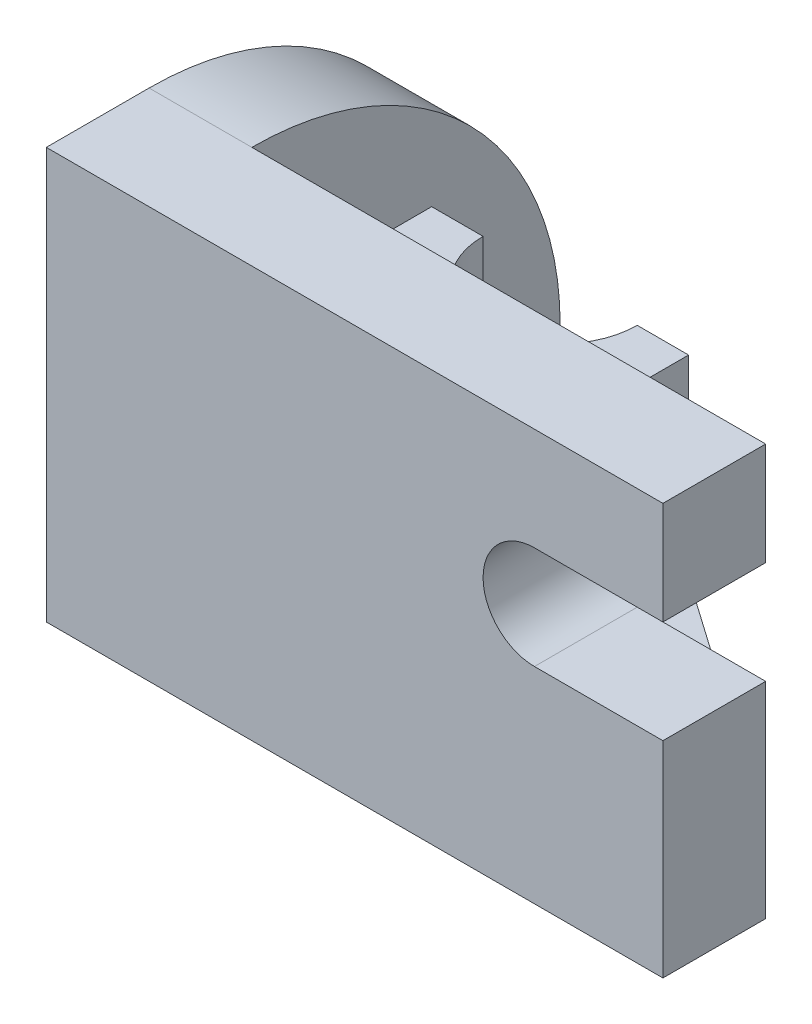
ISO-10303-21;
HEADER;
FILE_DESCRIPTION(('STEP AP214'),'2;1');
FILE_NAME('part.step','',(''),(''),'','','');
FILE_SCHEMA(('AUTOMOTIVE_DESIGN { 1 0 10303 214 1 1 1 1 }'));
ENDSEC;
DATA;
#1=APPLICATION_CONTEXT('core data for automotive mechanical design processes');
#2=APPLICATION_PROTOCOL_DEFINITION('international standard','automotive_design',2000,#1);
#3=PRODUCT_CONTEXT('',#1,'mechanical');
#4=PRODUCT('Part','Part','',(#3));
#5=PRODUCT_RELATED_PRODUCT_CATEGORY('part','',(#4));
#6=PRODUCT_DEFINITION_FORMATION('','',#4);
#7=PRODUCT_DEFINITION_CONTEXT('part definition',#1,'design');
#8=PRODUCT_DEFINITION('design','',#6,#7);
#9=PRODUCT_DEFINITION_SHAPE('','',#8);
#10=(LENGTH_UNIT() NAMED_UNIT(*) SI_UNIT(.MILLI.,.METRE.));
#11=(NAMED_UNIT(*) PLANE_ANGLE_UNIT() SI_UNIT($,.RADIAN.));
#12=(NAMED_UNIT(*) SI_UNIT($,.STERADIAN.) SOLID_ANGLE_UNIT());
#13=UNCERTAINTY_MEASURE_WITH_UNIT(LENGTH_MEASURE(1.E-05),#10,'distance_accuracy_value','');
#14=(GEOMETRIC_REPRESENTATION_CONTEXT(3) GLOBAL_UNCERTAINTY_ASSIGNED_CONTEXT((#13)) GLOBAL_UNIT_ASSIGNED_CONTEXT((#10,
#11,#12)) REPRESENTATION_CONTEXT('',''));
#15=CARTESIAN_POINT('',(0.,0.,0.));
#16=DIRECTION('',(0.,0.,1.));
#17=DIRECTION('',(1.,0.,0.));
#18=AXIS2_PLACEMENT_3D('',#15,#16,#17);
#19=CARTESIAN_POINT('',(0.,0.,-8.));
#20=DIRECTION('',(0.,0.,1.));
#21=DIRECTION('',(1.,0.,0.));
#22=AXIS2_PLACEMENT_3D('',#19,#20,#21);
#23=PLANE('',#22);
#24=DIRECTION('',(0.,-1.,0.));
#25=VECTOR('',#24,1.);
#26=CARTESIAN_POINT('',(-32.,0.,-8.));
#27=LINE('',#26,#25);
#28=CARTESIAN_POINT('',(-32.,32.,-8.));
#29=VERTEX_POINT('',#28);
#30=CARTESIAN_POINT('',(-32.,10.,-8.));
#31=VERTEX_POINT('',#30);
#32=EDGE_CURVE('E55',#29,#31,#27,.T.);
#33=ORIENTED_EDGE('',*,*,#32,.F.);
#34=DIRECTION('',(-1.,0.,0.));
#35=VECTOR('',#34,1.);
#36=CARTESIAN_POINT('',(-48.,32.,-8.));
#37=LINE('',#36,#35);
#38=CARTESIAN_POINT('',(48.,32.,-8.));
#39=VERTEX_POINT('',#38);
#40=EDGE_CURVE('E316',#39,#29,#37,.T.);
#41=ORIENTED_EDGE('',*,*,#40,.F.);
#42=DIRECTION('',(0.,1.,0.));
#43=VECTOR('',#42,1.);
#44=CARTESIAN_POINT('',(48.,32.,-8.));
#45=LINE('',#44,#43);
#46=CARTESIAN_POINT('',(48.,16.,-8.));
#47=VERTEX_POINT('',#46);
#48=EDGE_CURVE('E287',#47,#39,#45,.T.);
#49=ORIENTED_EDGE('',*,*,#48,.F.);
#50=DIRECTION('',(-1.,0.,0.));
#51=VECTOR('',#50,1.);
#52=CARTESIAN_POINT('',(0.,16.,-8.));
#53=LINE('',#52,#51);
#54=CARTESIAN_POINT('',(28.,16.,-8.));
#55=VERTEX_POINT('',#54);
#56=EDGE_CURVE('E260',#47,#55,#53,.T.);
#57=ORIENTED_EDGE('',*,*,#56,.T.);
#58=CARTESIAN_POINT('',(28.,8.,-8.));
#59=DIRECTION('',(0.,0.,1.));
#60=DIRECTION('',(1.,0.,0.));
#61=AXIS2_PLACEMENT_3D('',#58,#59,#60);
#62=CIRCLE('',#61,8.);
#63=CARTESIAN_POINT('',(28.,0.,-8.));
#64=VERTEX_POINT('',#63);
#65=EDGE_CURVE('E264',#55,#64,#62,.T.);
#66=ORIENTED_EDGE('',*,*,#65,.T.);
#67=DIRECTION('',(-1.,0.,0.));
#68=VECTOR('',#67,1.);
#69=CARTESIAN_POINT('',(0.,0.,-8.));
#70=LINE('',#69,#68);
#71=CARTESIAN_POINT('',(48.,0.,-8.));
#72=VERTEX_POINT('',#71);
#73=EDGE_CURVE('E269',#72,#64,#70,.T.);
#74=ORIENTED_EDGE('',*,*,#73,.F.);
#75=CARTESIAN_POINT('',(48.,-20.,-8.));
#76=VERTEX_POINT('',#75);
#77=EDGE_CURVE('E317',#76,#72,#45,.T.);
#78=ORIENTED_EDGE('',*,*,#77,.F.);
#79=DIRECTION('',(-1.,0.,0.));
#80=VECTOR('',#79,1.);
#81=CARTESIAN_POINT('',(48.,-20.,-8.));
#82=LINE('',#81,#80);
#83=CARTESIAN_POINT('',(8.00000000000002,-20.,-8.));
#84=VERTEX_POINT('',#83);
#85=EDGE_CURVE('E208',#76,#84,#82,.T.);
#86=ORIENTED_EDGE('',*,*,#85,.T.);
#87=DIRECTION('',(0.,-1.,0.));
#88=VECTOR('',#87,1.);
#89=CARTESIAN_POINT('',(8.00000000000002,10.,-8.));
#90=LINE('',#89,#88);
#91=CARTESIAN_POINT('',(8.00000000000002,10.,-8.));
#92=VERTEX_POINT('',#91);
#93=EDGE_CURVE('E249',#92,#84,#90,.T.);
#94=ORIENTED_EDGE('',*,*,#93,.F.);
#95=DIRECTION('',(-1.,0.,0.));
#96=VECTOR('',#95,1.);
#97=CARTESIAN_POINT('',(-32.,10.,-8.));
#98=LINE('',#97,#96);
#99=EDGE_CURVE('E242',#92,#31,#98,.T.);
#100=ORIENTED_EDGE('',*,*,#99,.T.);
#101=EDGE_LOOP('',(#33,#41,#49,#57,#66,#74,#78,#86,#94,#100));
#102=FACE_BOUND('',#101,.T.);
#103=ADVANCED_FACE('F39',(#102),#23,.F.);
#104=CARTESIAN_POINT('',(-32.,10.,-36.));
#105=DIRECTION('',(0.,0.,-1.));
#106=DIRECTION('',(-1.,0.,0.));
#107=AXIS2_PLACEMENT_3D('',#104,#105,#106);
#108=PLANE('',#107);
#109=DIRECTION('',(0.,1.,0.));
#110=VECTOR('',#109,1.);
#111=CARTESIAN_POINT('',(-24.,-32.,-36.));
#112=LINE('',#111,#110);
#113=CARTESIAN_POINT('',(-24.,-32.,-36.));
#114=VERTEX_POINT('',#113);
#115=CARTESIAN_POINT('',(-24.,10.,-36.));
#116=VERTEX_POINT('',#115);
#117=EDGE_CURVE('E63',#114,#116,#112,.T.);
#118=ORIENTED_EDGE('',*,*,#117,.F.);
#119=DIRECTION('',(1.,0.,0.));
#120=VECTOR('',#119,1.);
#121=CARTESIAN_POINT('',(-32.,-32.,-36.));
#122=LINE('',#121,#120);
#123=CARTESIAN_POINT('',(-32.,-32.,-36.));
#124=VERTEX_POINT('',#123);
#125=EDGE_CURVE('E234',#124,#114,#122,.T.);
#126=ORIENTED_EDGE('',*,*,#125,.F.);
#127=DIRECTION('',(0.,-1.,0.));
#128=VECTOR('',#127,1.);
#129=CARTESIAN_POINT('',(-32.,10.,-36.));
#130=LINE('',#129,#128);
#131=CARTESIAN_POINT('',(-32.,10.,-36.));
#132=VERTEX_POINT('',#131);
#133=EDGE_CURVE('E245',#132,#124,#130,.T.);
#134=ORIENTED_EDGE('',*,*,#133,.F.);
#135=DIRECTION('',(1.,0.,0.));
#136=VECTOR('',#135,1.);
#137=CARTESIAN_POINT('',(-32.,10.,-36.));
#138=LINE('',#137,#136);
#139=EDGE_CURVE('E235',#132,#116,#138,.T.);
#140=ORIENTED_EDGE('',*,*,#139,.T.);
#141=EDGE_LOOP('',(#118,#126,#134,#140));
#142=FACE_BOUND('',#141,.T.);
#143=ADVANCED_FACE('F342',(#142),#108,.T.);
#144=CARTESIAN_POINT('',(48.,32.,8.));
#145=DIRECTION('',(-1.,0.,0.));
#146=DIRECTION('',(0.,-1.,0.));
#147=AXIS2_PLACEMENT_3D('',#144,#145,#146);
#148=PLANE('',#147);
#149=DIRECTION('',(0.,0.,1.));
#150=VECTOR('',#149,1.);
#151=CARTESIAN_POINT('',(48.,0.,-8.));
#152=LINE('',#151,#150);
#153=CARTESIAN_POINT('',(48.,0.,8.));
#154=VERTEX_POINT('',#153);
#155=EDGE_CURVE('E288',#72,#154,#152,.T.);
#156=ORIENTED_EDGE('',*,*,#155,.T.);
#157=DIRECTION('',(0.,1.,0.));
#158=VECTOR('',#157,1.);
#159=CARTESIAN_POINT('',(48.,32.,8.));
#160=LINE('',#159,#158);
#161=CARTESIAN_POINT('',(48.,-32.,8.));
#162=VERTEX_POINT('',#161);
#163=EDGE_CURVE('E297',#162,#154,#160,.T.);
#164=ORIENTED_EDGE('',*,*,#163,.F.);
#165=DIRECTION('',(0.,0.,-1.));
#166=VECTOR('',#165,1.);
#167=CARTESIAN_POINT('',(48.,-32.,8.));
#168=LINE('',#167,#166);
#169=CARTESIAN_POINT('',(48.,-32.,-8.));
#170=VERTEX_POINT('',#169);
#171=EDGE_CURVE('E311',#162,#170,#168,.T.);
#172=ORIENTED_EDGE('',*,*,#171,.T.);
#173=EDGE_CURVE('E312',#170,#76,#45,.T.);
#174=ORIENTED_EDGE('',*,*,#173,.T.);
#175=ORIENTED_EDGE('',*,*,#77,.T.);
#176=EDGE_LOOP('',(#156,#164,#172,#174,#175));
#177=FACE_BOUND('',#176,.T.);
#178=ADVANCED_FACE('F347',(#177),#148,.F.);
#179=CARTESIAN_POINT('',(48.,16.,8.));
#180=VERTEX_POINT('',#179);
#181=CARTESIAN_POINT('',(48.,32.,8.));
#182=VERTEX_POINT('',#181);
#183=EDGE_CURVE('E302',#180,#182,#160,.T.);
#184=ORIENTED_EDGE('',*,*,#183,.F.);
#185=DIRECTION('',(0.,0.,1.));
#186=VECTOR('',#185,1.);
#187=CARTESIAN_POINT('',(48.,16.,-8.));
#188=LINE('',#187,#186);
#189=EDGE_CURVE('E284',#47,#180,#188,.T.);
#190=ORIENTED_EDGE('',*,*,#189,.F.);
#191=ORIENTED_EDGE('',*,*,#48,.T.);
#192=DIRECTION('',(0.,0.,-1.));
#193=VECTOR('',#192,1.);
#194=CARTESIAN_POINT('',(48.,32.,8.));
#195=LINE('',#194,#193);
#196=EDGE_CURVE('E48',#182,#39,#195,.T.);
#197=ORIENTED_EDGE('',*,*,#196,.F.);
#198=EDGE_LOOP('',(#184,#190,#191,#197));
#199=FACE_BOUND('',#198,.T.);
#200=ADVANCED_FACE('F41',(#199),#148,.F.);
#201=CARTESIAN_POINT('',(-48.,32.,8.));
#202=DIRECTION('',(0.,-1.,0.));
#203=DIRECTION('',(1.,0.,0.));
#204=AXIS2_PLACEMENT_3D('',#201,#202,#203);
#205=PLANE('',#204);
#206=DIRECTION('',(0.,0.,-1.));
#207=VECTOR('',#206,1.);
#208=CARTESIAN_POINT('',(-48.,32.,8.));
#209=LINE('',#208,#207);
#210=CARTESIAN_POINT('',(-48.,32.,8.));
#211=VERTEX_POINT('',#210);
#212=CARTESIAN_POINT('',(-48.,32.,-8.));
#213=VERTEX_POINT('',#212);
#214=EDGE_CURVE('E326',#211,#213,#209,.T.);
#215=ORIENTED_EDGE('',*,*,#214,.F.);
#216=DIRECTION('',(-1.,0.,0.));
#217=VECTOR('',#216,1.);
#218=CARTESIAN_POINT('',(-48.,32.,8.));
#219=LINE('',#218,#217);
#220=EDGE_CURVE('E301',#182,#211,#219,.T.);
#221=ORIENTED_EDGE('',*,*,#220,.F.);
#222=ORIENTED_EDGE('',*,*,#196,.T.);
#223=ORIENTED_EDGE('',*,*,#40,.T.);
#224=DIRECTION('',(-1.,0.,0.));
#225=VECTOR('',#224,1.);
#226=CARTESIAN_POINT('',(-32.,32.,-7.99999999999966));
#227=LINE('',#226,#225);
#228=EDGE_CURVE('E171',#29,#213,#227,.T.);
#229=ORIENTED_EDGE('',*,*,#228,.T.);
#230=EDGE_LOOP('',(#215,#221,#222,#223,#229));
#231=FACE_BOUND('',#230,.T.);
#232=ADVANCED_FACE('F335',(#231),#205,.F.);
#233=CARTESIAN_POINT('',(-48.,32.,8.));
#234=DIRECTION('',(1.,0.,0.));
#235=DIRECTION('',(0.,1.,0.));
#236=AXIS2_PLACEMENT_3D('',#233,#234,#235);
#237=PLANE('',#236);
#238=ORIENTED_EDGE('',*,*,#214,.T.);
#239=CARTESIAN_POINT('',(-48.,-16.,-8.));
#240=DIRECTION('',(-1.,0.,0.));
#241=DIRECTION('',(0.,-1.,0.));
#242=AXIS2_PLACEMENT_3D('',#239,#240,#241);
#243=CIRCLE('',#242,48.);
#244=CARTESIAN_POINT('',(-48.,-16.0000000000003,-56.));
#245=VERTEX_POINT('',#244);
#246=EDGE_CURVE('E187',#213,#245,#243,.T.);
#247=ORIENTED_EDGE('',*,*,#246,.T.);
#248=DIRECTION('',(0.,-1.,0.));
#249=VECTOR('',#248,1.);
#250=CARTESIAN_POINT('',(-48.,-16.0000000000003,-56.));
#251=LINE('',#250,#249);
#252=CARTESIAN_POINT('',(-48.,-32.,-56.));
#253=VERTEX_POINT('',#252);
#254=EDGE_CURVE('E164',#245,#253,#251,.T.);
#255=ORIENTED_EDGE('',*,*,#254,.T.);
#256=DIRECTION('',(0.,0.,-1.));
#257=VECTOR('',#256,1.);
#258=CARTESIAN_POINT('',(-48.,-32.,8.));
#259=LINE('',#258,#257);
#260=CARTESIAN_POINT('',(-48.,-32.,8.));
#261=VERTEX_POINT('',#260);
#262=EDGE_CURVE('E323',#261,#253,#259,.T.);
#263=ORIENTED_EDGE('',*,*,#262,.F.);
#264=DIRECTION('',(0.,-1.,0.));
#265=VECTOR('',#264,1.);
#266=CARTESIAN_POINT('',(-48.,32.,8.));
#267=LINE('',#266,#265);
#268=EDGE_CURVE('E305',#211,#261,#267,.T.);
#269=ORIENTED_EDGE('',*,*,#268,.F.);
#270=EDGE_LOOP('',(#238,#247,#255,#263,#269));
#271=FACE_BOUND('',#270,.T.);
#272=ADVANCED_FACE('F358',(#271),#237,.F.);
#273=CARTESIAN_POINT('',(-48.,-32.,8.));
#274=DIRECTION('',(0.,1.,0.));
#275=DIRECTION('',(0.,0.,1.));
#276=AXIS2_PLACEMENT_3D('',#273,#274,#275);
#277=PLANE('',#276);
#278=ORIENTED_EDGE('',*,*,#262,.T.);
#279=DIRECTION('',(-1.,0.,0.));
#280=VECTOR('',#279,1.);
#281=CARTESIAN_POINT('',(-32.,-32.,-56.));
#282=LINE('',#281,#280);
#283=CARTESIAN_POINT('',(-32.,-32.,-56.));
#284=VERTEX_POINT('',#283);
#285=EDGE_CURVE('E170',#284,#253,#282,.T.);
#286=ORIENTED_EDGE('',*,*,#285,.F.);
#287=DIRECTION('',(0.,0.,1.));
#288=VECTOR('',#287,1.);
#289=CARTESIAN_POINT('',(-32.,-32.,8.));
#290=LINE('',#289,#288);
#291=EDGE_CURVE('E179',#284,#124,#290,.T.);
#292=ORIENTED_EDGE('',*,*,#291,.T.);
#293=ORIENTED_EDGE('',*,*,#125,.T.);
#294=CARTESIAN_POINT('',(-12.,-32.,-36.));
#295=DIRECTION('',(0.,1.,0.));
#296=DIRECTION('',(0.,0.,1.));
#297=AXIS2_PLACEMENT_3D('',#294,#295,#296);
#298=CIRCLE('',#297,12.);
#299=CARTESIAN_POINT('',(0.,-32.,-36.));
#300=VERTEX_POINT('',#299);
#301=EDGE_CURVE('E219',#114,#300,#298,.T.);
#302=ORIENTED_EDGE('',*,*,#301,.T.);
#303=CARTESIAN_POINT('',(8.00000000000002,-32.,-36.));
#304=VERTEX_POINT('',#303);
#305=EDGE_CURVE('E228',#300,#304,#122,.T.);
#306=ORIENTED_EDGE('',*,*,#305,.T.);
#307=DIRECTION('',(0.81923192051904,0.,0.573462344363329));
#308=VECTOR('',#307,1.);
#309=CARTESIAN_POINT('',(8.00000000000002,-32.,-36.));
#310=LINE('',#309,#308);
#311=EDGE_CURVE('E200',#304,#170,#310,.T.);
#312=ORIENTED_EDGE('',*,*,#311,.T.);
#313=ORIENTED_EDGE('',*,*,#171,.F.);
#314=DIRECTION('',(1.,0.,0.));
#315=VECTOR('',#314,1.);
#316=CARTESIAN_POINT('',(-48.,-32.,8.));
#317=LINE('',#316,#315);
#318=EDGE_CURVE('E308',#261,#162,#317,.T.);
#319=ORIENTED_EDGE('',*,*,#318,.F.);
#320=EDGE_LOOP('',(#278,#286,#292,#293,#302,#306,#312,#313,#319));
#321=FACE_BOUND('',#320,.T.);
#322=ADVANCED_FACE('F355',(#321),#277,.F.);
#323=CARTESIAN_POINT('',(0.,0.,8.));
#324=DIRECTION('',(0.,0.,1.));
#325=DIRECTION('',(1.,0.,0.));
#326=AXIS2_PLACEMENT_3D('',#323,#324,#325);
#327=PLANE('',#326);
#328=ORIENTED_EDGE('',*,*,#318,.T.);
#329=ORIENTED_EDGE('',*,*,#163,.T.);
#330=DIRECTION('',(-1.,0.,0.));
#331=VECTOR('',#330,1.);
#332=CARTESIAN_POINT('',(0.,0.,8.));
#333=LINE('',#332,#331);
#334=CARTESIAN_POINT('',(28.,0.,8.));
#335=VERTEX_POINT('',#334);
#336=EDGE_CURVE('E265',#154,#335,#333,.T.);
#337=ORIENTED_EDGE('',*,*,#336,.T.);
#338=CARTESIAN_POINT('',(28.,8.,8.));
#339=DIRECTION('',(0.,0.,1.));
#340=DIRECTION('',(1.,0.,0.));
#341=AXIS2_PLACEMENT_3D('',#338,#339,#340);
#342=CIRCLE('',#341,8.);
#343=CARTESIAN_POINT('',(28.,16.,8.));
#344=VERTEX_POINT('',#343);
#345=EDGE_CURVE('E277',#344,#335,#342,.T.);
#346=ORIENTED_EDGE('',*,*,#345,.F.);
#347=DIRECTION('',(-1.,0.,0.));
#348=VECTOR('',#347,1.);
#349=CARTESIAN_POINT('',(0.,16.,8.));
#350=LINE('',#349,#348);
#351=EDGE_CURVE('E253',#180,#344,#350,.T.);
#352=ORIENTED_EDGE('',*,*,#351,.F.);
#353=ORIENTED_EDGE('',*,*,#183,.T.);
#354=ORIENTED_EDGE('',*,*,#220,.T.);
#355=ORIENTED_EDGE('',*,*,#268,.T.);
#356=EDGE_LOOP('',(#328,#329,#337,#346,#352,#353,#354,#355));
#357=FACE_BOUND('',#356,.T.);
#358=ADVANCED_FACE('F353',(#357),#327,.T.);
#359=CARTESIAN_POINT('',(0.,16.,-8.));
#360=DIRECTION('',(0.,1.,0.));
#361=DIRECTION('',(-1.,0.,0.));
#362=AXIS2_PLACEMENT_3D('',#359,#360,#361);
#363=PLANE('',#362);
#364=ORIENTED_EDGE('',*,*,#351,.T.);
#365=DIRECTION('',(0.,0.,1.));
#366=VECTOR('',#365,1.);
#367=CARTESIAN_POINT('',(28.,16.,-8.));
#368=LINE('',#367,#366);
#369=EDGE_CURVE('E273',#55,#344,#368,.T.);
#370=ORIENTED_EDGE('',*,*,#369,.F.);
#371=ORIENTED_EDGE('',*,*,#56,.F.);
#372=ORIENTED_EDGE('',*,*,#189,.T.);
#373=EDGE_LOOP('',(#364,#370,#371,#372));
#374=FACE_BOUND('',#373,.T.);
#375=ADVANCED_FACE('F424',(#374),#363,.F.);
#376=CARTESIAN_POINT('',(0.,0.,-8.));
#377=DIRECTION('',(0.,1.,0.));
#378=DIRECTION('',(-1.,0.,0.));
#379=AXIS2_PLACEMENT_3D('',#376,#377,#378);
#380=PLANE('',#379);
#381=ORIENTED_EDGE('',*,*,#336,.F.);
#382=ORIENTED_EDGE('',*,*,#155,.F.);
#383=ORIENTED_EDGE('',*,*,#73,.T.);
#384=DIRECTION('',(0.,0.,1.));
#385=VECTOR('',#384,1.);
#386=CARTESIAN_POINT('',(28.,0.,-8.));
#387=LINE('',#386,#385);
#388=EDGE_CURVE('E292',#64,#335,#387,.T.);
#389=ORIENTED_EDGE('',*,*,#388,.T.);
#390=EDGE_LOOP('',(#381,#382,#383,#389));
#391=FACE_BOUND('',#390,.T.);
#392=ADVANCED_FACE('F421',(#391),#380,.T.);
#393=CARTESIAN_POINT('',(28.,8.,-8.));
#394=DIRECTION('',(0.,0.,1.));
#395=DIRECTION('',(1.,0.,0.));
#396=AXIS2_PLACEMENT_3D('',#393,#394,#395);
#397=CYLINDRICAL_SURFACE('',#396,8.);
#398=ORIENTED_EDGE('',*,*,#345,.T.);
#399=ORIENTED_EDGE('',*,*,#388,.F.);
#400=ORIENTED_EDGE('',*,*,#65,.F.);
#401=ORIENTED_EDGE('',*,*,#369,.T.);
#402=EDGE_LOOP('',(#398,#399,#400,#401));
#403=FACE_BOUND('',#402,.T.);
#404=ADVANCED_FACE('F418',(#403),#397,.F.);
#405=CARTESIAN_POINT('',(8.00000000000002,10.,-8.));
#406=DIRECTION('',(1.,0.,0.));
#407=DIRECTION('',(0.,0.,-1.));
#408=AXIS2_PLACEMENT_3D('',#405,#406,#407);
#409=PLANE('',#408);
#410=DIRECTION('',(0.,0.,-1.));
#411=VECTOR('',#410,1.);
#412=CARTESIAN_POINT('',(8.00000000000002,-20.,-8.));
#413=LINE('',#412,#411);
#414=CARTESIAN_POINT('',(8.00000000000002,-20.,-36.));
#415=VERTEX_POINT('',#414);
#416=EDGE_CURVE('E201',#84,#415,#413,.T.);
#417=ORIENTED_EDGE('',*,*,#416,.T.);
#418=DIRECTION('',(0.,-1.,0.));
#419=VECTOR('',#418,1.);
#420=CARTESIAN_POINT('',(8.00000000000002,10.,-36.));
#421=LINE('',#420,#419);
#422=CARTESIAN_POINT('',(8.00000000000002,10.,-36.));
#423=VERTEX_POINT('',#422);
#424=EDGE_CURVE('E254',#423,#415,#421,.T.);
#425=ORIENTED_EDGE('',*,*,#424,.F.);
#426=DIRECTION('',(0.,0.,1.));
#427=VECTOR('',#426,1.);
#428=CARTESIAN_POINT('',(8.00000000000002,10.,-8.));
#429=LINE('',#428,#427);
#430=EDGE_CURVE('E239',#423,#92,#429,.T.);
#431=ORIENTED_EDGE('',*,*,#430,.T.);
#432=ORIENTED_EDGE('',*,*,#93,.T.);
#433=EDGE_LOOP('',(#417,#425,#431,#432));
#434=FACE_BOUND('',#433,.T.);
#435=ADVANCED_FACE('F401',(#434),#409,.T.);
#436=DIRECTION('',(0.,1.,0.));
#437=VECTOR('',#436,1.);
#438=CARTESIAN_POINT('',(0.,-32.,-36.));
#439=LINE('',#438,#437);
#440=CARTESIAN_POINT('',(0.,10.,-36.));
#441=VERTEX_POINT('',#440);
#442=EDGE_CURVE('E223',#441,#300,#439,.F.);
#443=ORIENTED_EDGE('',*,*,#442,.F.);
#444=EDGE_CURVE('E233',#441,#423,#138,.T.);
#445=ORIENTED_EDGE('',*,*,#444,.T.);
#446=ORIENTED_EDGE('',*,*,#424,.T.);
#447=DIRECTION('',(0.,-1.,0.));
#448=VECTOR('',#447,1.);
#449=CARTESIAN_POINT('',(8.00000000000002,-20.,-36.));
#450=LINE('',#449,#448);
#451=EDGE_CURVE('E212',#415,#304,#450,.T.);
#452=ORIENTED_EDGE('',*,*,#451,.T.);
#453=ORIENTED_EDGE('',*,*,#305,.F.);
#454=EDGE_LOOP('',(#443,#445,#446,#452,#453));
#455=FACE_BOUND('',#454,.T.);
#456=ADVANCED_FACE('F350',(#455),#108,.T.);
#457=CARTESIAN_POINT('',(0.,10.,0.));
#458=DIRECTION('',(0.,-1.,0.));
#459=DIRECTION('',(0.,0.,-1.));
#460=AXIS2_PLACEMENT_3D('',#457,#458,#459);
#461=PLANE('',#460);
#462=ORIENTED_EDGE('',*,*,#444,.F.);
#463=CARTESIAN_POINT('',(-12.,10.,-36.));
#464=DIRECTION('',(0.,-1.,0.));
#465=DIRECTION('',(0.,0.,-1.));
#466=AXIS2_PLACEMENT_3D('',#463,#464,#465);
#467=CIRCLE('',#466,12.);
#468=EDGE_CURVE('E11',#441,#116,#467,.T.);
#469=ORIENTED_EDGE('',*,*,#468,.T.);
#470=ORIENTED_EDGE('',*,*,#139,.F.);
#471=DIRECTION('',(0.,0.,-1.));
#472=VECTOR('',#471,1.);
#473=CARTESIAN_POINT('',(-32.,10.,-8.));
#474=LINE('',#473,#472);
#475=EDGE_CURVE('E229',#31,#132,#474,.T.);
#476=ORIENTED_EDGE('',*,*,#475,.F.);
#477=ORIENTED_EDGE('',*,*,#99,.F.);
#478=ORIENTED_EDGE('',*,*,#430,.F.);
#479=EDGE_LOOP('',(#462,#469,#470,#476,#477,#478));
#480=FACE_BOUND('',#479,.T.);
#481=ADVANCED_FACE('F404',(#480),#461,.F.);
#482=CARTESIAN_POINT('',(-12.,-32.,-36.));
#483=DIRECTION('',(0.,1.,0.));
#484=DIRECTION('',(0.,0.,1.));
#485=AXIS2_PLACEMENT_3D('',#482,#483,#484);
#486=CYLINDRICAL_SURFACE('',#485,12.);
#487=ORIENTED_EDGE('',*,*,#117,.T.);
#488=ORIENTED_EDGE('',*,*,#468,.F.);
#489=ORIENTED_EDGE('',*,*,#442,.T.);
#490=ORIENTED_EDGE('',*,*,#301,.F.);
#491=EDGE_LOOP('',(#487,#488,#489,#490));
#492=FACE_BOUND('',#491,.T.);
#493=ADVANCED_FACE('F406',(#492),#486,.F.);
#494=CARTESIAN_POINT('',(8.00000000000002,-20.,-36.));
#495=DIRECTION('',(0.573462344363329,0.,-0.81923192051904));
#496=DIRECTION('',(-0.81923192051904,0.,-0.573462344363329));
#497=AXIS2_PLACEMENT_3D('',#494,#495,#496);
#498=PLANE('',#497);
#499=ORIENTED_EDGE('',*,*,#311,.F.);
#500=ORIENTED_EDGE('',*,*,#451,.F.);
#501=DIRECTION('',(0.81923192051904,0.,0.573462344363329));
#502=VECTOR('',#501,1.);
#503=CARTESIAN_POINT('',(8.00000000000002,-20.,-36.));
#504=LINE('',#503,#502);
#505=EDGE_CURVE('E205',#415,#76,#504,.T.);
#506=ORIENTED_EDGE('',*,*,#505,.T.);
#507=ORIENTED_EDGE('',*,*,#173,.F.);
#508=EDGE_LOOP('',(#499,#500,#506,#507));
#509=FACE_BOUND('',#508,.T.);
#510=ADVANCED_FACE('F385',(#509),#498,.T.);
#511=CARTESIAN_POINT('',(0.,-20.,0.));
#512=DIRECTION('',(0.,1.,0.));
#513=DIRECTION('',(0.,0.,1.));
#514=AXIS2_PLACEMENT_3D('',#511,#512,#513);
#515=PLANE('',#514);
#516=ORIENTED_EDGE('',*,*,#416,.F.);
#517=ORIENTED_EDGE('',*,*,#85,.F.);
#518=ORIENTED_EDGE('',*,*,#505,.F.);
#519=EDGE_LOOP('',(#516,#517,#518));
#520=FACE_BOUND('',#519,.T.);
#521=ADVANCED_FACE('F389',(#520),#515,.T.);
#522=CARTESIAN_POINT('',(-32.,-16.,-8.));
#523=DIRECTION('',(-1.,0.,0.));
#524=DIRECTION('',(0.,-1.,0.));
#525=AXIS2_PLACEMENT_3D('',#522,#523,#524);
#526=PLANE('',#525);
#527=CARTESIAN_POINT('',(-32.,-16.,-8.));
#528=DIRECTION('',(-1.,0.,0.));
#529=DIRECTION('',(0.,-1.,0.));
#530=AXIS2_PLACEMENT_3D('',#527,#528,#529);
#531=CIRCLE('',#530,48.);
#532=CARTESIAN_POINT('',(-32.,-16.0000000000003,-56.));
#533=VERTEX_POINT('',#532);
#534=EDGE_CURVE('E176',#29,#533,#531,.T.);
#535=ORIENTED_EDGE('',*,*,#534,.F.);
#536=ORIENTED_EDGE('',*,*,#32,.T.);
#537=ORIENTED_EDGE('',*,*,#475,.T.);
#538=ORIENTED_EDGE('',*,*,#133,.T.);
#539=ORIENTED_EDGE('',*,*,#291,.F.);
#540=DIRECTION('',(0.,-1.,0.));
#541=VECTOR('',#540,1.);
#542=CARTESIAN_POINT('',(-32.,-16.0000000000003,-56.));
#543=LINE('',#542,#541);
#544=EDGE_CURVE('E161',#533,#284,#543,.T.);
#545=ORIENTED_EDGE('',*,*,#544,.F.);
#546=EDGE_LOOP('',(#535,#536,#537,#538,#539,#545));
#547=FACE_BOUND('',#546,.T.);
#548=ADVANCED_FACE('F175',(#547),#526,.F.);
#549=CARTESIAN_POINT('',(-32.,-16.0000000000003,-56.));
#550=DIRECTION('',(0.,0.,-1.));
#551=DIRECTION('',(-1.,0.,0.));
#552=AXIS2_PLACEMENT_3D('',#549,#550,#551);
#553=PLANE('',#552);
#554=ORIENTED_EDGE('',*,*,#254,.F.);
#555=DIRECTION('',(-1.,0.,0.));
#556=VECTOR('',#555,1.);
#557=CARTESIAN_POINT('',(-32.,-16.0000000000003,-56.));
#558=LINE('',#557,#556);
#559=EDGE_CURVE('E157',#533,#245,#558,.T.);
#560=ORIENTED_EDGE('',*,*,#559,.F.);
#561=ORIENTED_EDGE('',*,*,#544,.T.);
#562=ORIENTED_EDGE('',*,*,#285,.T.);
#563=EDGE_LOOP('',(#554,#560,#561,#562));
#564=FACE_BOUND('',#563,.T.);
#565=ADVANCED_FACE('F159',(#564),#553,.T.);
#566=CARTESIAN_POINT('',(-32.,-16.,-8.));
#567=DIRECTION('',(-1.,0.,0.));
#568=DIRECTION('',(0.,-1.,0.));
#569=AXIS2_PLACEMENT_3D('',#566,#567,#568);
#570=CYLINDRICAL_SURFACE('',#569,48.);
#571=ORIENTED_EDGE('',*,*,#246,.F.);
#572=ORIENTED_EDGE('',*,*,#228,.F.);
#573=ORIENTED_EDGE('',*,*,#534,.T.);
#574=ORIENTED_EDGE('',*,*,#559,.T.);
#575=EDGE_LOOP('',(#571,#572,#573,#574));
#576=FACE_BOUND('',#575,.T.);
#577=ADVANCED_FACE('F183',(#576),#570,.T.);
#578=CLOSED_SHELL('',(#103,#143,#178,#200,#232,#272,#322,#358,#375,#392,#404,#435,#456,#481,
#493,#510,#521,#548,#565,#577));
#579=MANIFOLD_SOLID_BREP('B2',#578);
#580=ADVANCED_BREP_SHAPE_REPRESENTATION('',(#18,#579),#14);
#581=SHAPE_DEFINITION_REPRESENTATION(#9,#580);
ENDSEC;
END-ISO-10303-21;
